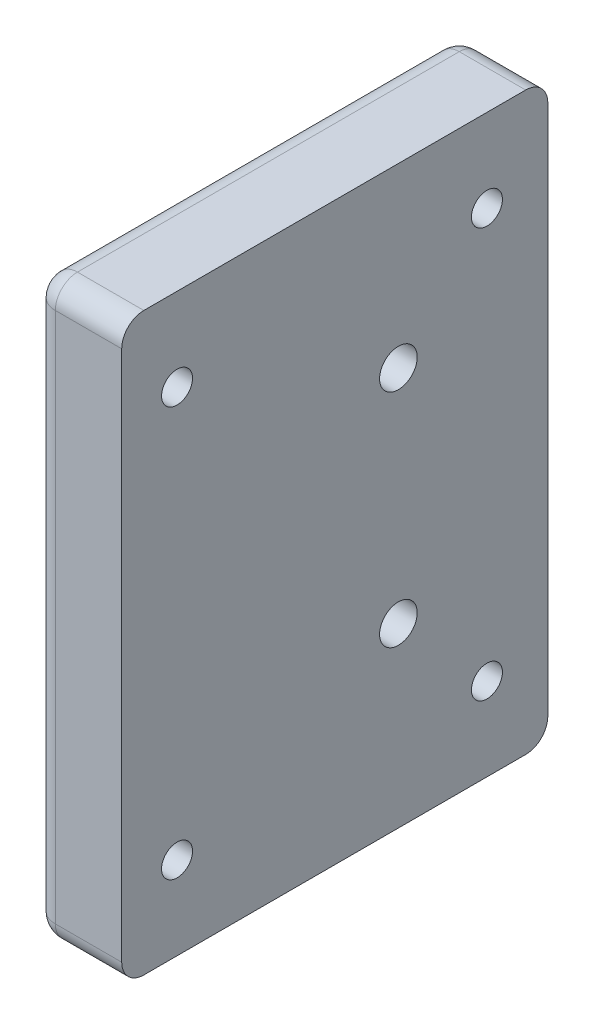
ISO-10303-21;
HEADER;
FILE_DESCRIPTION(('STEP AP214'),'2;1');
FILE_NAME('part.step','',(''),(''),'','','');
FILE_SCHEMA(('AUTOMOTIVE_DESIGN { 1 0 10303 214 1 1 1 1 }'));
ENDSEC;
DATA;
#1=APPLICATION_CONTEXT('core data for automotive mechanical design processes');
#2=APPLICATION_PROTOCOL_DEFINITION('international standard','automotive_design',2000,#1);
#3=PRODUCT_CONTEXT('',#1,'mechanical');
#4=PRODUCT('Part','Part','',(#3));
#5=PRODUCT_RELATED_PRODUCT_CATEGORY('part','',(#4));
#6=PRODUCT_DEFINITION_FORMATION('','',#4);
#7=PRODUCT_DEFINITION_CONTEXT('part definition',#1,'design');
#8=PRODUCT_DEFINITION('design','',#6,#7);
#9=PRODUCT_DEFINITION_SHAPE('','',#8);
#10=(LENGTH_UNIT() NAMED_UNIT(*) SI_UNIT(.MILLI.,.METRE.));
#11=(NAMED_UNIT(*) PLANE_ANGLE_UNIT() SI_UNIT($,.RADIAN.));
#12=(NAMED_UNIT(*) SI_UNIT($,.STERADIAN.) SOLID_ANGLE_UNIT());
#13=UNCERTAINTY_MEASURE_WITH_UNIT(LENGTH_MEASURE(1.E-05),#10,'distance_accuracy_value','');
#14=(GEOMETRIC_REPRESENTATION_CONTEXT(3) GLOBAL_UNCERTAINTY_ASSIGNED_CONTEXT((#13)) GLOBAL_UNIT_ASSIGNED_CONTEXT((#10,
#11,#12)) REPRESENTATION_CONTEXT('',''));
#15=CARTESIAN_POINT('',(0.,0.,0.));
#16=DIRECTION('',(0.,0.,1.));
#17=DIRECTION('',(1.,0.,0.));
#18=AXIS2_PLACEMENT_3D('',#15,#16,#17);
#19=CARTESIAN_POINT('',(54.,24.,220.));
#20=DIRECTION('',(1.,0.,0.));
#21=DIRECTION('',(0.,1.,0.));
#22=AXIS2_PLACEMENT_3D('',#19,#20,#21);
#23=CYLINDRICAL_SURFACE('',#22,2.);
#24=CARTESIAN_POINT('',(56.,24.,220.));
#25=DIRECTION('',(1.,0.,0.));
#26=DIRECTION('',(0.,0.,1.));
#27=AXIS2_PLACEMENT_3D('',#24,#25,#26);
#28=CIRCLE('',#27,2.);
#29=CARTESIAN_POINT('',(56.,26.,220.));
#30=VERTEX_POINT('',#29);
#31=CARTESIAN_POINT('',(56.,24.,222.));
#32=VERTEX_POINT('',#31);
#33=EDGE_CURVE('E151',#30,#32,#28,.T.);
#34=ORIENTED_EDGE('',*,*,#33,.T.);
#35=DIRECTION('',(1.,0.,0.));
#36=VECTOR('',#35,1.);
#37=CARTESIAN_POINT('',(54.,24.,222.));
#38=LINE('',#37,#36);
#39=CARTESIAN_POINT('',(62.,24.,222.));
#40=VERTEX_POINT('',#39);
#41=EDGE_CURVE('E276',#32,#40,#38,.T.);
#42=ORIENTED_EDGE('',*,*,#41,.T.);
#43=CARTESIAN_POINT('',(62.,24.,220.));
#44=DIRECTION('',(1.,0.,0.));
#45=DIRECTION('',(0.,0.,1.));
#46=AXIS2_PLACEMENT_3D('',#43,#44,#45);
#47=CIRCLE('',#46,2.);
#48=CARTESIAN_POINT('',(62.,26.,220.));
#49=VERTEX_POINT('',#48);
#50=EDGE_CURVE('E25',#49,#40,#47,.T.);
#51=ORIENTED_EDGE('',*,*,#50,.F.);
#52=DIRECTION('',(1.,0.,0.));
#53=VECTOR('',#52,1.);
#54=CARTESIAN_POINT('',(54.,26.,220.));
#55=LINE('',#54,#53);
#56=EDGE_CURVE('E158',#30,#49,#55,.T.);
#57=ORIENTED_EDGE('',*,*,#56,.F.);
#58=EDGE_LOOP('',(#34,#42,#51,#57));
#59=FACE_BOUND('',#58,.T.);
#60=ADVANCED_FACE('F14',(#59),#23,.T.);
#61=CARTESIAN_POINT('',(54.,24.,185.5));
#62=DIRECTION('',(1.,0.,0.));
#63=DIRECTION('',(0.,1.,0.));
#64=AXIS2_PLACEMENT_3D('',#61,#62,#63);
#65=CYLINDRICAL_SURFACE('',#64,2.);
#66=DIRECTION('',(1.,0.,0.));
#67=VECTOR('',#66,1.);
#68=CARTESIAN_POINT('',(54.,26.,185.5));
#69=LINE('',#68,#67);
#70=CARTESIAN_POINT('',(56.,26.,185.5));
#71=VERTEX_POINT('',#70);
#72=CARTESIAN_POINT('',(62.,26.,185.5));
#73=VERTEX_POINT('',#72);
#74=EDGE_CURVE('E207',#71,#73,#69,.T.);
#75=ORIENTED_EDGE('',*,*,#74,.T.);
#76=CARTESIAN_POINT('',(62.,24.,185.5));
#77=DIRECTION('',(-1.,0.,0.));
#78=DIRECTION('',(0.,0.,1.));
#79=AXIS2_PLACEMENT_3D('',#76,#77,#78);
#80=CIRCLE('',#79,2.);
#81=CARTESIAN_POINT('',(62.,24.,183.5));
#82=VERTEX_POINT('',#81);
#83=EDGE_CURVE('E178',#73,#82,#80,.T.);
#84=ORIENTED_EDGE('',*,*,#83,.T.);
#85=DIRECTION('',(1.,0.,0.));
#86=VECTOR('',#85,1.);
#87=CARTESIAN_POINT('',(54.,24.,183.5));
#88=LINE('',#87,#86);
#89=CARTESIAN_POINT('',(56.,24.,183.5));
#90=VERTEX_POINT('',#89);
#91=EDGE_CURVE('E323',#90,#82,#88,.T.);
#92=ORIENTED_EDGE('',*,*,#91,.F.);
#93=CARTESIAN_POINT('',(56.,24.,185.5));
#94=DIRECTION('',(1.,0.,0.));
#95=DIRECTION('',(0.,1.,0.));
#96=AXIS2_PLACEMENT_3D('',#93,#94,#95);
#97=CIRCLE('',#96,2.);
#98=EDGE_CURVE('E322',#90,#71,#97,.T.);
#99=ORIENTED_EDGE('',*,*,#98,.T.);
#100=EDGE_LOOP('',(#75,#84,#92,#99));
#101=FACE_BOUND('',#100,.T.);
#102=ADVANCED_FACE('F351',(#101),#65,.T.);
#103=CARTESIAN_POINT('',(54.,-24.,220.));
#104=DIRECTION('',(1.,0.,0.));
#105=DIRECTION('',(0.,-1.,0.));
#106=AXIS2_PLACEMENT_3D('',#103,#104,#105);
#107=CYLINDRICAL_SURFACE('',#106,2.);
#108=DIRECTION('',(1.,0.,0.));
#109=VECTOR('',#108,1.);
#110=CARTESIAN_POINT('',(54.,-26.,220.));
#111=LINE('',#110,#109);
#112=CARTESIAN_POINT('',(56.,-26.,220.));
#113=VERTEX_POINT('',#112);
#114=CARTESIAN_POINT('',(62.,-26.,220.));
#115=VERTEX_POINT('',#114);
#116=EDGE_CURVE('E57',#113,#115,#111,.T.);
#117=ORIENTED_EDGE('',*,*,#116,.T.);
#118=CARTESIAN_POINT('',(62.,-24.,220.));
#119=DIRECTION('',(-1.,0.,0.));
#120=DIRECTION('',(0.,0.,1.));
#121=AXIS2_PLACEMENT_3D('',#118,#119,#120);
#122=CIRCLE('',#121,2.);
#123=CARTESIAN_POINT('',(62.,-24.,222.));
#124=VERTEX_POINT('',#123);
#125=EDGE_CURVE('E9',#115,#124,#122,.T.);
#126=ORIENTED_EDGE('',*,*,#125,.T.);
#127=DIRECTION('',(1.,0.,0.));
#128=VECTOR('',#127,1.);
#129=CARTESIAN_POINT('',(54.,-24.,222.));
#130=LINE('',#129,#128);
#131=CARTESIAN_POINT('',(56.,-24.,222.));
#132=VERTEX_POINT('',#131);
#133=EDGE_CURVE('E279',#132,#124,#130,.T.);
#134=ORIENTED_EDGE('',*,*,#133,.F.);
#135=CARTESIAN_POINT('',(56.,-24.,220.));
#136=DIRECTION('',(1.,0.,0.));
#137=DIRECTION('',(0.,-1.,0.));
#138=AXIS2_PLACEMENT_3D('',#135,#136,#137);
#139=CIRCLE('',#138,2.);
#140=EDGE_CURVE('E195',#132,#113,#139,.T.);
#141=ORIENTED_EDGE('',*,*,#140,.T.);
#142=EDGE_LOOP('',(#117,#126,#134,#141));
#143=FACE_BOUND('',#142,.T.);
#144=ADVANCED_FACE('F404',(#143),#107,.T.);
#145=CARTESIAN_POINT('',(54.,-24.,185.5));
#146=DIRECTION('',(1.,0.,0.));
#147=DIRECTION('',(0.,-1.,0.));
#148=AXIS2_PLACEMENT_3D('',#145,#146,#147);
#149=CYLINDRICAL_SURFACE('',#148,2.);
#150=CARTESIAN_POINT('',(56.,-24.,185.5));
#151=DIRECTION('',(-1.,0.,0.));
#152=DIRECTION('',(0.,-1.,0.));
#153=AXIS2_PLACEMENT_3D('',#150,#151,#152);
#154=CIRCLE('',#153,2.);
#155=CARTESIAN_POINT('',(56.,-24.,183.5));
#156=VERTEX_POINT('',#155);
#157=CARTESIAN_POINT('',(56.,-26.,185.5));
#158=VERTEX_POINT('',#157);
#159=EDGE_CURVE('E239',#156,#158,#154,.T.);
#160=ORIENTED_EDGE('',*,*,#159,.F.);
#161=DIRECTION('',(1.,0.,0.));
#162=VECTOR('',#161,1.);
#163=CARTESIAN_POINT('',(54.,-24.,183.5));
#164=LINE('',#163,#162);
#165=CARTESIAN_POINT('',(62.,-24.,183.5));
#166=VERTEX_POINT('',#165);
#167=EDGE_CURVE('E173',#156,#166,#164,.T.);
#168=ORIENTED_EDGE('',*,*,#167,.T.);
#169=CARTESIAN_POINT('',(62.,-24.,185.5));
#170=DIRECTION('',(1.,0.,0.));
#171=DIRECTION('',(0.,0.,1.));
#172=AXIS2_PLACEMENT_3D('',#169,#170,#171);
#173=CIRCLE('',#172,2.);
#174=CARTESIAN_POINT('',(62.,-26.,185.5));
#175=VERTEX_POINT('',#174);
#176=EDGE_CURVE('E170',#175,#166,#173,.T.);
#177=ORIENTED_EDGE('',*,*,#176,.F.);
#178=DIRECTION('',(1.,0.,0.));
#179=VECTOR('',#178,1.);
#180=CARTESIAN_POINT('',(54.,-26.,185.5));
#181=LINE('',#180,#179);
#182=EDGE_CURVE('E73',#158,#175,#181,.T.);
#183=ORIENTED_EDGE('',*,*,#182,.F.);
#184=EDGE_LOOP('',(#160,#168,#177,#183));
#185=FACE_BOUND('',#184,.T.);
#186=ADVANCED_FACE('F172',(#185),#149,.T.);
#187=CARTESIAN_POINT('',(62.,-26.,183.5));
#188=DIRECTION('',(1.,0.,0.));
#189=DIRECTION('',(0.,1.,0.));
#190=AXIS2_PLACEMENT_3D('',#187,#188,#189);
#191=PLANE('',#190);
#192=CARTESIAN_POINT('',(62.,-18.5,217.));
#193=DIRECTION('',(1.,0.,0.));
#194=DIRECTION('',(0.,0.,-1.));
#195=AXIS2_PLACEMENT_3D('',#192,#193,#194);
#196=CIRCLE('',#195,1.4);
#197=CARTESIAN_POINT('',(62.,-18.5,215.6));
#198=VERTEX_POINT('',#197);
#199=EDGE_CURVE('E242',#198,#198,#196,.T.);
#200=ORIENTED_EDGE('',*,*,#199,.F.);
#201=EDGE_LOOP('',(#200));
#202=FACE_BOUND('',#201,.T.);
#203=CARTESIAN_POINT('',(62.,-10.,197.));
#204=DIRECTION('',(1.,0.,0.));
#205=DIRECTION('',(0.,0.,-1.));
#206=AXIS2_PLACEMENT_3D('',#203,#204,#205);
#207=CIRCLE('',#206,1.7);
#208=CARTESIAN_POINT('',(62.,-10.,195.3));
#209=VERTEX_POINT('',#208);
#210=EDGE_CURVE('E285',#209,#209,#207,.T.);
#211=ORIENTED_EDGE('',*,*,#210,.F.);
#212=EDGE_LOOP('',(#211));
#213=FACE_BOUND('',#212,.T.);
#214=CARTESIAN_POINT('',(62.,-18.5,189.));
#215=DIRECTION('',(1.,0.,0.));
#216=DIRECTION('',(0.,0.,-1.));
#217=AXIS2_PLACEMENT_3D('',#214,#215,#216);
#218=CIRCLE('',#217,1.4);
#219=CARTESIAN_POINT('',(62.,-18.5,187.6));
#220=VERTEX_POINT('',#219);
#221=EDGE_CURVE('E248',#220,#220,#218,.T.);
#222=ORIENTED_EDGE('',*,*,#221,.F.);
#223=EDGE_LOOP('',(#222));
#224=FACE_BOUND('',#223,.T.);
#225=CARTESIAN_POINT('',(62.,18.5,217.));
#226=DIRECTION('',(1.,0.,0.));
#227=DIRECTION('',(0.,0.,-1.));
#228=AXIS2_PLACEMENT_3D('',#225,#226,#227);
#229=CIRCLE('',#228,1.4);
#230=CARTESIAN_POINT('',(62.,18.5,215.6));
#231=VERTEX_POINT('',#230);
#232=EDGE_CURVE('E480',#231,#231,#229,.T.);
#233=ORIENTED_EDGE('',*,*,#232,.F.);
#234=EDGE_LOOP('',(#233));
#235=FACE_BOUND('',#234,.T.);
#236=CARTESIAN_POINT('',(62.,10.,197.));
#237=DIRECTION('',(1.,0.,0.));
#238=DIRECTION('',(0.,0.,-1.));
#239=AXIS2_PLACEMENT_3D('',#236,#237,#238);
#240=CIRCLE('',#239,1.7);
#241=CARTESIAN_POINT('',(62.,10.,195.3));
#242=VERTEX_POINT('',#241);
#243=EDGE_CURVE('E237',#242,#242,#240,.T.);
#244=ORIENTED_EDGE('',*,*,#243,.F.);
#245=EDGE_LOOP('',(#244));
#246=FACE_BOUND('',#245,.T.);
#247=CARTESIAN_POINT('',(62.,18.5,189.));
#248=DIRECTION('',(1.,0.,0.));
#249=DIRECTION('',(0.,0.,-1.));
#250=AXIS2_PLACEMENT_3D('',#247,#248,#249);
#251=CIRCLE('',#250,1.4);
#252=CARTESIAN_POINT('',(62.,18.5,187.6));
#253=VERTEX_POINT('',#252);
#254=EDGE_CURVE('E238',#253,#253,#251,.T.);
#255=ORIENTED_EDGE('',*,*,#254,.F.);
#256=EDGE_LOOP('',(#255));
#257=FACE_BOUND('',#256,.T.);
#258=DIRECTION('',(0.,0.,1.));
#259=VECTOR('',#258,1.);
#260=CARTESIAN_POINT('',(62.,-26.,183.5));
#261=LINE('',#260,#259);
#262=EDGE_CURVE('E180',#175,#115,#261,.T.);
#263=ORIENTED_EDGE('',*,*,#262,.F.);
#264=ORIENTED_EDGE('',*,*,#176,.T.);
#265=DIRECTION('',(0.,1.,0.));
#266=VECTOR('',#265,1.);
#267=CARTESIAN_POINT('',(62.,-26.,183.5));
#268=LINE('',#267,#266);
#269=EDGE_CURVE('E320',#166,#82,#268,.T.);
#270=ORIENTED_EDGE('',*,*,#269,.T.);
#271=ORIENTED_EDGE('',*,*,#83,.F.);
#272=DIRECTION('',(0.,0.,1.));
#273=VECTOR('',#272,1.);
#274=CARTESIAN_POINT('',(62.,26.,183.5));
#275=LINE('',#274,#273);
#276=EDGE_CURVE('E290',#73,#49,#275,.T.);
#277=ORIENTED_EDGE('',*,*,#276,.T.);
#278=ORIENTED_EDGE('',*,*,#50,.T.);
#279=DIRECTION('',(0.,1.,0.));
#280=VECTOR('',#279,1.);
#281=CARTESIAN_POINT('',(62.,-26.,222.));
#282=LINE('',#281,#280);
#283=EDGE_CURVE('E280',#124,#40,#282,.T.);
#284=ORIENTED_EDGE('',*,*,#283,.F.);
#285=ORIENTED_EDGE('',*,*,#125,.F.);
#286=EDGE_LOOP('',(#263,#264,#270,#271,#277,#278,#284,#285));
#287=FACE_BOUND('',#286,.T.);
#288=ADVANCED_FACE('F181',(#202,#213,#224,#235,#246,#257,#287),#191,.T.);
#289=CARTESIAN_POINT('',(54.,26.,183.5));
#290=DIRECTION('',(0.,1.,0.));
#291=DIRECTION('',(1.,0.,0.));
#292=AXIS2_PLACEMENT_3D('',#289,#290,#291);
#293=PLANE('',#292);
#294=ORIENTED_EDGE('',*,*,#276,.F.);
#295=ORIENTED_EDGE('',*,*,#74,.F.);
#296=DIRECTION('',(0.,0.,1.));
#297=VECTOR('',#296,1.);
#298=CARTESIAN_POINT('',(56.,26.,183.5));
#299=LINE('',#298,#297);
#300=EDGE_CURVE('E261',#71,#30,#299,.T.);
#301=ORIENTED_EDGE('',*,*,#300,.T.);
#302=ORIENTED_EDGE('',*,*,#56,.T.);
#303=EDGE_LOOP('',(#294,#295,#301,#302));
#304=FACE_BOUND('',#303,.T.);
#305=ADVANCED_FACE('F364',(#304),#293,.T.);
#306=CARTESIAN_POINT('',(56.,24.,220.));
#307=DIRECTION('',(0.,-1.,0.));
#308=DIRECTION('',(-1.,0.,0.));
#309=AXIS2_PLACEMENT_3D('',#306,#307,#308);
#310=SPHERICAL_SURFACE('',#309,2.);
#311=CARTESIAN_POINT('',(56.,24.,220.));
#312=DIRECTION('',(0.,1.,0.));
#313=DIRECTION('',(-1.,0.,0.));
#314=AXIS2_PLACEMENT_3D('',#311,#312,#313);
#315=CIRCLE('',#314,2.);
#316=CARTESIAN_POINT('',(54.,24.,220.));
#317=VERTEX_POINT('',#316);
#318=EDGE_CURVE('E247',#317,#32,#315,.T.);
#319=ORIENTED_EDGE('',*,*,#318,.T.);
#320=ORIENTED_EDGE('',*,*,#33,.F.);
#321=CARTESIAN_POINT('',(56.,24.,220.));
#322=DIRECTION('',(0.,0.,1.));
#323=DIRECTION('',(-1.,0.,0.));
#324=AXIS2_PLACEMENT_3D('',#321,#322,#323);
#325=CIRCLE('',#324,2.);
#326=EDGE_CURVE('E258',#30,#317,#325,.T.);
#327=ORIENTED_EDGE('',*,*,#326,.T.);
#328=EDGE_LOOP('',(#319,#320,#327));
#329=FACE_BOUND('',#328,.T.);
#330=ADVANCED_FACE('F386',(#329),#310,.T.);
#331=CARTESIAN_POINT('',(54.,-26.,222.));
#332=DIRECTION('',(0.,0.,1.));
#333=DIRECTION('',(1.,0.,0.));
#334=AXIS2_PLACEMENT_3D('',#331,#332,#333);
#335=PLANE('',#334);
#336=ORIENTED_EDGE('',*,*,#283,.T.);
#337=ORIENTED_EDGE('',*,*,#41,.F.);
#338=DIRECTION('',(0.,1.,0.));
#339=VECTOR('',#338,1.);
#340=CARTESIAN_POINT('',(56.,-26.,222.));
#341=LINE('',#340,#339);
#342=EDGE_CURVE('E243',#132,#32,#341,.T.);
#343=ORIENTED_EDGE('',*,*,#342,.F.);
#344=ORIENTED_EDGE('',*,*,#133,.T.);
#345=EDGE_LOOP('',(#336,#337,#343,#344));
#346=FACE_BOUND('',#345,.T.);
#347=ADVANCED_FACE('F388',(#346),#335,.T.);
#348=CARTESIAN_POINT('',(56.,24.,185.5));
#349=DIRECTION('',(0.,0.,1.));
#350=DIRECTION('',(-1.,0.,0.));
#351=AXIS2_PLACEMENT_3D('',#348,#349,#350);
#352=SPHERICAL_SURFACE('',#351,2.);
#353=CARTESIAN_POINT('',(56.,24.,185.5));
#354=DIRECTION('',(0.,0.,-1.));
#355=DIRECTION('',(-1.,0.,0.));
#356=AXIS2_PLACEMENT_3D('',#353,#354,#355);
#357=CIRCLE('',#356,2.);
#358=CARTESIAN_POINT('',(54.,24.,185.5));
#359=VERTEX_POINT('',#358);
#360=EDGE_CURVE('E266',#359,#71,#357,.T.);
#361=ORIENTED_EDGE('',*,*,#360,.T.);
#362=ORIENTED_EDGE('',*,*,#98,.F.);
#363=CARTESIAN_POINT('',(56.,24.,185.5));
#364=DIRECTION('',(0.,1.,0.));
#365=DIRECTION('',(-1.,0.,0.));
#366=AXIS2_PLACEMENT_3D('',#363,#364,#365);
#367=CIRCLE('',#366,2.);
#368=EDGE_CURVE('E313',#90,#359,#367,.T.);
#369=ORIENTED_EDGE('',*,*,#368,.T.);
#370=EDGE_LOOP('',(#361,#362,#369));
#371=FACE_BOUND('',#370,.T.);
#372=ADVANCED_FACE('F357',(#371),#352,.T.);
#373=CARTESIAN_POINT('',(54.,-26.,183.5));
#374=DIRECTION('',(0.,0.,1.));
#375=DIRECTION('',(1.,0.,0.));
#376=AXIS2_PLACEMENT_3D('',#373,#374,#375);
#377=PLANE('',#376);
#378=ORIENTED_EDGE('',*,*,#167,.F.);
#379=DIRECTION('',(0.,1.,0.));
#380=VECTOR('',#379,1.);
#381=CARTESIAN_POINT('',(56.,-26.,183.5));
#382=LINE('',#381,#380);
#383=EDGE_CURVE('E232',#156,#90,#382,.T.);
#384=ORIENTED_EDGE('',*,*,#383,.T.);
#385=ORIENTED_EDGE('',*,*,#91,.T.);
#386=ORIENTED_EDGE('',*,*,#269,.F.);
#387=EDGE_LOOP('',(#378,#384,#385,#386));
#388=FACE_BOUND('',#387,.T.);
#389=ADVANCED_FACE('F366',(#388),#377,.F.);
#390=CARTESIAN_POINT('',(54.,-26.,183.5));
#391=DIRECTION('',(0.,1.,0.));
#392=DIRECTION('',(1.,0.,0.));
#393=AXIS2_PLACEMENT_3D('',#390,#391,#392);
#394=PLANE('',#393);
#395=ORIENTED_EDGE('',*,*,#116,.F.);
#396=DIRECTION('',(0.,0.,1.));
#397=VECTOR('',#396,1.);
#398=CARTESIAN_POINT('',(56.,-26.,183.5));
#399=LINE('',#398,#397);
#400=EDGE_CURVE('E187',#158,#113,#399,.T.);
#401=ORIENTED_EDGE('',*,*,#400,.F.);
#402=ORIENTED_EDGE('',*,*,#182,.T.);
#403=ORIENTED_EDGE('',*,*,#262,.T.);
#404=EDGE_LOOP('',(#395,#401,#402,#403));
#405=FACE_BOUND('',#404,.T.);
#406=ADVANCED_FACE('F185',(#405),#394,.F.);
#407=CARTESIAN_POINT('',(56.,-24.,220.));
#408=DIRECTION('',(0.,0.,-1.));
#409=DIRECTION('',(-1.,0.,0.));
#410=AXIS2_PLACEMENT_3D('',#407,#408,#409);
#411=SPHERICAL_SURFACE('',#410,2.);
#412=CARTESIAN_POINT('',(56.,-24.,220.));
#413=DIRECTION('',(0.,0.,1.));
#414=DIRECTION('',(-1.,0.,0.));
#415=AXIS2_PLACEMENT_3D('',#412,#413,#414);
#416=CIRCLE('',#415,2.);
#417=CARTESIAN_POINT('',(54.,-24.,220.));
#418=VERTEX_POINT('',#417);
#419=EDGE_CURVE('E199',#418,#113,#416,.T.);
#420=ORIENTED_EDGE('',*,*,#419,.T.);
#421=ORIENTED_EDGE('',*,*,#140,.F.);
#422=CARTESIAN_POINT('',(56.,-24.,220.));
#423=DIRECTION('',(0.,-1.,0.));
#424=DIRECTION('',(-1.,0.,0.));
#425=AXIS2_PLACEMENT_3D('',#422,#423,#424);
#426=CIRCLE('',#425,2.);
#427=EDGE_CURVE('E231',#132,#418,#426,.T.);
#428=ORIENTED_EDGE('',*,*,#427,.T.);
#429=EDGE_LOOP('',(#420,#421,#428));
#430=FACE_BOUND('',#429,.T.);
#431=ADVANCED_FACE('F415',(#430),#411,.T.);
#432=CARTESIAN_POINT('',(56.,-24.,185.5));
#433=DIRECTION('',(0.,0.,1.));
#434=DIRECTION('',(-1.,0.,0.));
#435=AXIS2_PLACEMENT_3D('',#432,#433,#434);
#436=SPHERICAL_SURFACE('',#435,2.);
#437=CARTESIAN_POINT('',(56.,-24.,185.5));
#438=DIRECTION('',(0.,1.,0.));
#439=DIRECTION('',(-1.,0.,0.));
#440=AXIS2_PLACEMENT_3D('',#437,#438,#439);
#441=CIRCLE('',#440,2.);
#442=CARTESIAN_POINT('',(54.,-24.,185.5));
#443=VERTEX_POINT('',#442);
#444=EDGE_CURVE('E229',#156,#443,#441,.T.);
#445=ORIENTED_EDGE('',*,*,#444,.F.);
#446=ORIENTED_EDGE('',*,*,#159,.T.);
#447=CARTESIAN_POINT('',(56.,-24.,185.5));
#448=DIRECTION('',(0.,0.,1.));
#449=DIRECTION('',(-1.,0.,0.));
#450=AXIS2_PLACEMENT_3D('',#447,#448,#449);
#451=CIRCLE('',#450,2.);
#452=EDGE_CURVE('E210',#443,#158,#451,.T.);
#453=ORIENTED_EDGE('',*,*,#452,.F.);
#454=EDGE_LOOP('',(#445,#446,#453));
#455=FACE_BOUND('',#454,.T.);
#456=ADVANCED_FACE('F412',(#455),#436,.T.);
#457=CARTESIAN_POINT('',(53.9,-18.5,217.));
#458=DIRECTION('',(1.,0.,0.));
#459=DIRECTION('',(0.,0.,-1.));
#460=AXIS2_PLACEMENT_3D('',#457,#458,#459);
#461=CYLINDRICAL_SURFACE('',#460,1.4);
#462=DIRECTION('',(1.,0.,0.));
#463=VECTOR('',#462,1.);
#464=CARTESIAN_POINT('',(53.9,-18.5,215.6));
#465=LINE('',#464,#463);
#466=CARTESIAN_POINT('',(54.,-18.5,215.6));
#467=VERTEX_POINT('',#466);
#468=EDGE_CURVE('E289',#467,#198,#465,.T.);
#469=ORIENTED_EDGE('',*,*,#468,.F.);
#470=CARTESIAN_POINT('',(54.,-18.5,217.));
#471=DIRECTION('',(1.,0.,0.));
#472=DIRECTION('',(0.,0.,-1.));
#473=AXIS2_PLACEMENT_3D('',#470,#471,#472);
#474=CIRCLE('',#473,1.4);
#475=EDGE_CURVE('E204',#467,#467,#474,.T.);
#476=ORIENTED_EDGE('',*,*,#475,.F.);
#477=ORIENTED_EDGE('',*,*,#468,.T.);
#478=ORIENTED_EDGE('',*,*,#199,.T.);
#479=EDGE_LOOP('',(#469,#476,#477,#478));
#480=FACE_BOUND('',#479,.T.);
#481=ADVANCED_FACE('F409',(#480),#461,.F.);
#482=CARTESIAN_POINT('',(53.9,-10.,197.));
#483=DIRECTION('',(1.,0.,0.));
#484=DIRECTION('',(0.,0.,-1.));
#485=AXIS2_PLACEMENT_3D('',#482,#483,#484);
#486=CYLINDRICAL_SURFACE('',#485,1.7);
#487=DIRECTION('',(1.,0.,0.));
#488=VECTOR('',#487,1.);
#489=CARTESIAN_POINT('',(53.9,-10.,195.3));
#490=LINE('',#489,#488);
#491=CARTESIAN_POINT('',(54.,-10.,195.3));
#492=VERTEX_POINT('',#491);
#493=EDGE_CURVE('E251',#492,#209,#490,.T.);
#494=ORIENTED_EDGE('',*,*,#493,.F.);
#495=CARTESIAN_POINT('',(54.,-10.,197.));
#496=DIRECTION('',(1.,0.,0.));
#497=DIRECTION('',(0.,0.,-1.));
#498=AXIS2_PLACEMENT_3D('',#495,#496,#497);
#499=CIRCLE('',#498,1.7);
#500=EDGE_CURVE('E201',#492,#492,#499,.T.);
#501=ORIENTED_EDGE('',*,*,#500,.F.);
#502=ORIENTED_EDGE('',*,*,#493,.T.);
#503=ORIENTED_EDGE('',*,*,#210,.T.);
#504=EDGE_LOOP('',(#494,#501,#502,#503));
#505=FACE_BOUND('',#504,.T.);
#506=ADVANCED_FACE('F411',(#505),#486,.F.);
#507=CARTESIAN_POINT('',(53.9,-18.5,189.));
#508=DIRECTION('',(1.,0.,0.));
#509=DIRECTION('',(0.,0.,-1.));
#510=AXIS2_PLACEMENT_3D('',#507,#508,#509);
#511=CYLINDRICAL_SURFACE('',#510,1.4);
#512=DIRECTION('',(1.,0.,0.));
#513=VECTOR('',#512,1.);
#514=CARTESIAN_POINT('',(53.9,-18.5,187.6));
#515=LINE('',#514,#513);
#516=CARTESIAN_POINT('',(54.,-18.5,187.6));
#517=VERTEX_POINT('',#516);
#518=EDGE_CURVE('E252',#517,#220,#515,.T.);
#519=ORIENTED_EDGE('',*,*,#518,.F.);
#520=CARTESIAN_POINT('',(54.,-18.5,189.));
#521=DIRECTION('',(1.,0.,0.));
#522=DIRECTION('',(0.,0.,-1.));
#523=AXIS2_PLACEMENT_3D('',#520,#521,#522);
#524=CIRCLE('',#523,1.4);
#525=EDGE_CURVE('E205',#517,#517,#524,.T.);
#526=ORIENTED_EDGE('',*,*,#525,.F.);
#527=ORIENTED_EDGE('',*,*,#518,.T.);
#528=ORIENTED_EDGE('',*,*,#221,.T.);
#529=EDGE_LOOP('',(#519,#526,#527,#528));
#530=FACE_BOUND('',#529,.T.);
#531=ADVANCED_FACE('F16',(#530),#511,.F.);
#532=CARTESIAN_POINT('',(53.9,18.5,217.));
#533=DIRECTION('',(1.,0.,0.));
#534=DIRECTION('',(0.,0.,-1.));
#535=AXIS2_PLACEMENT_3D('',#532,#533,#534);
#536=CYLINDRICAL_SURFACE('',#535,1.4);
#537=DIRECTION('',(1.,0.,0.));
#538=VECTOR('',#537,1.);
#539=CARTESIAN_POINT('',(53.9,18.5,215.6));
#540=LINE('',#539,#538);
#541=CARTESIAN_POINT('',(54.,18.5,215.6));
#542=VERTEX_POINT('',#541);
#543=EDGE_CURVE('E18',#542,#231,#540,.T.);
#544=ORIENTED_EDGE('',*,*,#543,.F.);
#545=CARTESIAN_POINT('',(54.,18.5,217.));
#546=DIRECTION('',(1.,0.,0.));
#547=DIRECTION('',(0.,0.,-1.));
#548=AXIS2_PLACEMENT_3D('',#545,#546,#547);
#549=CIRCLE('',#548,1.4);
#550=EDGE_CURVE('E301',#542,#542,#549,.T.);
#551=ORIENTED_EDGE('',*,*,#550,.F.);
#552=ORIENTED_EDGE('',*,*,#543,.T.);
#553=ORIENTED_EDGE('',*,*,#232,.T.);
#554=EDGE_LOOP('',(#544,#551,#552,#553));
#555=FACE_BOUND('',#554,.T.);
#556=ADVANCED_FACE('F439',(#555),#536,.F.);
#557=CARTESIAN_POINT('',(53.9,10.,197.));
#558=DIRECTION('',(1.,0.,0.));
#559=DIRECTION('',(0.,0.,-1.));
#560=AXIS2_PLACEMENT_3D('',#557,#558,#559);
#561=CYLINDRICAL_SURFACE('',#560,1.7);
#562=DIRECTION('',(1.,0.,0.));
#563=VECTOR('',#562,1.);
#564=CARTESIAN_POINT('',(53.9,10.,195.3));
#565=LINE('',#564,#563);
#566=CARTESIAN_POINT('',(54.,10.,195.3));
#567=VERTEX_POINT('',#566);
#568=EDGE_CURVE('E233',#567,#242,#565,.T.);
#569=ORIENTED_EDGE('',*,*,#568,.F.);
#570=CARTESIAN_POINT('',(54.,10.,197.));
#571=DIRECTION('',(1.,0.,0.));
#572=DIRECTION('',(0.,0.,-1.));
#573=AXIS2_PLACEMENT_3D('',#570,#571,#572);
#574=CIRCLE('',#573,1.7);
#575=EDGE_CURVE('E227',#567,#567,#574,.T.);
#576=ORIENTED_EDGE('',*,*,#575,.F.);
#577=ORIENTED_EDGE('',*,*,#568,.T.);
#578=ORIENTED_EDGE('',*,*,#243,.T.);
#579=EDGE_LOOP('',(#569,#576,#577,#578));
#580=FACE_BOUND('',#579,.T.);
#581=ADVANCED_FACE('F453',(#580),#561,.F.);
#582=CARTESIAN_POINT('',(53.9,18.5,189.));
#583=DIRECTION('',(1.,0.,0.));
#584=DIRECTION('',(0.,0.,-1.));
#585=AXIS2_PLACEMENT_3D('',#582,#583,#584);
#586=CYLINDRICAL_SURFACE('',#585,1.4);
#587=DIRECTION('',(1.,0.,0.));
#588=VECTOR('',#587,1.);
#589=CARTESIAN_POINT('',(53.9,18.5,187.6));
#590=LINE('',#589,#588);
#591=CARTESIAN_POINT('',(54.,18.5,187.6));
#592=VERTEX_POINT('',#591);
#593=EDGE_CURVE('E270',#592,#253,#590,.T.);
#594=ORIENTED_EDGE('',*,*,#593,.F.);
#595=CARTESIAN_POINT('',(54.,18.5,189.));
#596=DIRECTION('',(1.,0.,0.));
#597=DIRECTION('',(0.,0.,-1.));
#598=AXIS2_PLACEMENT_3D('',#595,#596,#597);
#599=CIRCLE('',#598,1.4);
#600=EDGE_CURVE('E294',#592,#592,#599,.T.);
#601=ORIENTED_EDGE('',*,*,#600,.F.);
#602=ORIENTED_EDGE('',*,*,#593,.T.);
#603=ORIENTED_EDGE('',*,*,#254,.T.);
#604=EDGE_LOOP('',(#594,#601,#602,#603));
#605=FACE_BOUND('',#604,.T.);
#606=ADVANCED_FACE('F443',(#605),#586,.F.);
#607=CARTESIAN_POINT('',(56.,24.,183.5));
#608=DIRECTION('',(0.,0.,1.));
#609=DIRECTION('',(-1.,0.,0.));
#610=AXIS2_PLACEMENT_3D('',#607,#608,#609);
#611=CYLINDRICAL_SURFACE('',#610,2.);
#612=ORIENTED_EDGE('',*,*,#326,.F.);
#613=ORIENTED_EDGE('',*,*,#300,.F.);
#614=ORIENTED_EDGE('',*,*,#360,.F.);
#615=DIRECTION('',(0.,0.,1.));
#616=VECTOR('',#615,1.);
#617=CARTESIAN_POINT('',(54.,24.,183.5));
#618=LINE('',#617,#616);
#619=EDGE_CURVE('E257',#359,#317,#618,.T.);
#620=ORIENTED_EDGE('',*,*,#619,.T.);
#621=EDGE_LOOP('',(#612,#613,#614,#620));
#622=FACE_BOUND('',#621,.T.);
#623=ADVANCED_FACE('F362',(#622),#611,.T.);
#624=CARTESIAN_POINT('',(56.,-26.,220.));
#625=DIRECTION('',(0.,1.,0.));
#626=DIRECTION('',(-1.,0.,0.));
#627=AXIS2_PLACEMENT_3D('',#624,#625,#626);
#628=CYLINDRICAL_SURFACE('',#627,2.);
#629=ORIENTED_EDGE('',*,*,#427,.F.);
#630=ORIENTED_EDGE('',*,*,#342,.T.);
#631=ORIENTED_EDGE('',*,*,#318,.F.);
#632=DIRECTION('',(0.,1.,0.));
#633=VECTOR('',#632,1.);
#634=CARTESIAN_POINT('',(54.,-26.,220.));
#635=LINE('',#634,#633);
#636=EDGE_CURVE('E253',#418,#317,#635,.T.);
#637=ORIENTED_EDGE('',*,*,#636,.F.);
#638=EDGE_LOOP('',(#629,#630,#631,#637));
#639=FACE_BOUND('',#638,.T.);
#640=ADVANCED_FACE('F383',(#639),#628,.T.);
#641=CARTESIAN_POINT('',(56.,-26.,185.5));
#642=DIRECTION('',(0.,1.,0.));
#643=DIRECTION('',(-1.,0.,0.));
#644=AXIS2_PLACEMENT_3D('',#641,#642,#643);
#645=CYLINDRICAL_SURFACE('',#644,2.);
#646=DIRECTION('',(0.,1.,0.));
#647=VECTOR('',#646,1.);
#648=CARTESIAN_POINT('',(54.,-26.,185.5));
#649=LINE('',#648,#647);
#650=EDGE_CURVE('E265',#443,#359,#649,.T.);
#651=ORIENTED_EDGE('',*,*,#650,.T.);
#652=ORIENTED_EDGE('',*,*,#368,.F.);
#653=ORIENTED_EDGE('',*,*,#383,.F.);
#654=ORIENTED_EDGE('',*,*,#444,.T.);
#655=EDGE_LOOP('',(#651,#652,#653,#654));
#656=FACE_BOUND('',#655,.T.);
#657=ADVANCED_FACE('F371',(#656),#645,.T.);
#658=CARTESIAN_POINT('',(56.,-24.,183.5));
#659=DIRECTION('',(0.,0.,1.));
#660=DIRECTION('',(-1.,0.,0.));
#661=AXIS2_PLACEMENT_3D('',#658,#659,#660);
#662=CYLINDRICAL_SURFACE('',#661,2.);
#663=DIRECTION('',(0.,0.,1.));
#664=VECTOR('',#663,1.);
#665=CARTESIAN_POINT('',(54.,-24.,183.5));
#666=LINE('',#665,#664);
#667=EDGE_CURVE('E298',#443,#418,#666,.T.);
#668=ORIENTED_EDGE('',*,*,#667,.F.);
#669=ORIENTED_EDGE('',*,*,#452,.T.);
#670=ORIENTED_EDGE('',*,*,#400,.T.);
#671=ORIENTED_EDGE('',*,*,#419,.F.);
#672=EDGE_LOOP('',(#668,#669,#670,#671));
#673=FACE_BOUND('',#672,.T.);
#674=ADVANCED_FACE('F408',(#673),#662,.T.);
#675=CARTESIAN_POINT('',(54.,-26.,183.5));
#676=DIRECTION('',(1.,0.,0.));
#677=DIRECTION('',(0.,1.,0.));
#678=AXIS2_PLACEMENT_3D('',#675,#676,#677);
#679=PLANE('',#678);
#680=ORIENTED_EDGE('',*,*,#475,.T.);
#681=EDGE_LOOP('',(#680));
#682=FACE_BOUND('',#681,.T.);
#683=ORIENTED_EDGE('',*,*,#500,.T.);
#684=EDGE_LOOP('',(#683));
#685=FACE_BOUND('',#684,.T.);
#686=ORIENTED_EDGE('',*,*,#525,.T.);
#687=EDGE_LOOP('',(#686));
#688=FACE_BOUND('',#687,.T.);
#689=ORIENTED_EDGE('',*,*,#550,.T.);
#690=EDGE_LOOP('',(#689));
#691=FACE_BOUND('',#690,.T.);
#692=ORIENTED_EDGE('',*,*,#575,.T.);
#693=EDGE_LOOP('',(#692));
#694=FACE_BOUND('',#693,.T.);
#695=ORIENTED_EDGE('',*,*,#600,.T.);
#696=EDGE_LOOP('',(#695));
#697=FACE_BOUND('',#696,.T.);
#698=ORIENTED_EDGE('',*,*,#636,.T.);
#699=ORIENTED_EDGE('',*,*,#619,.F.);
#700=ORIENTED_EDGE('',*,*,#650,.F.);
#701=ORIENTED_EDGE('',*,*,#667,.T.);
#702=EDGE_LOOP('',(#698,#699,#700,#701));
#703=FACE_BOUND('',#702,.T.);
#704=ADVANCED_FACE('F378',(#682,#685,#688,#691,#694,#697,#703),#679,.F.);
#705=CLOSED_SHELL('',(#60,#102,#144,#186,#288,#305,#330,#347,#372,#389,#406,#431,#456,#481,#506,
#531,#556,#581,#606,#623,#640,#657,#674,#704));
#706=MANIFOLD_SOLID_BREP('B1',#705);
#707=ADVANCED_BREP_SHAPE_REPRESENTATION('',(#18,#706),#14);
#708=SHAPE_DEFINITION_REPRESENTATION(#9,#707);
ENDSEC;
END-ISO-10303-21;
